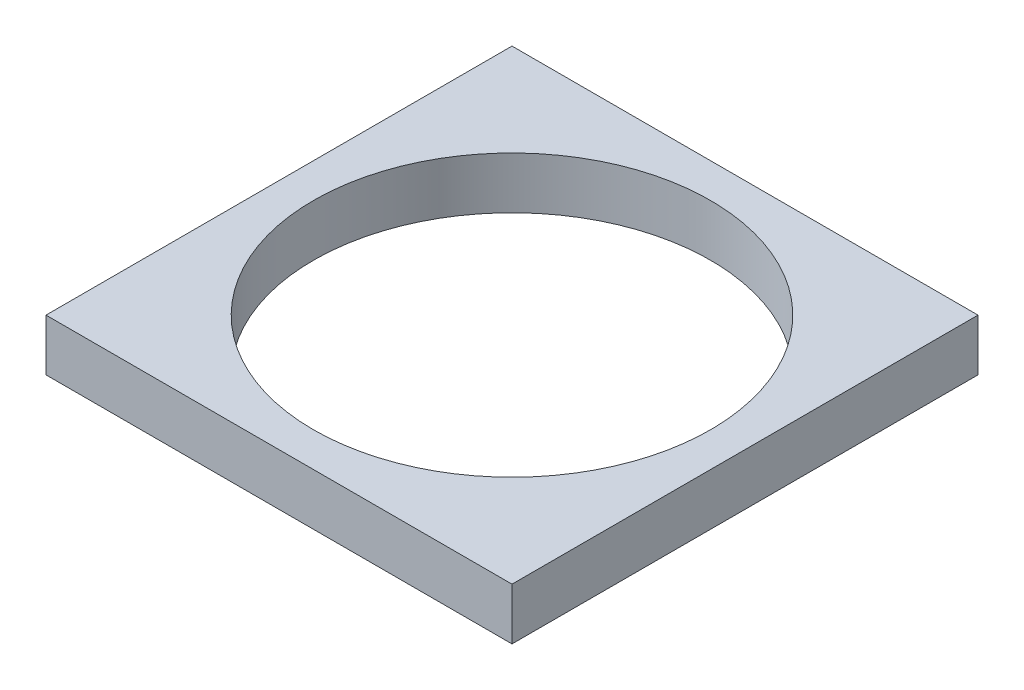
ISO-10303-21;
HEADER;
FILE_DESCRIPTION(('STEP AP214'),'2;1');
FILE_NAME('part.step','',(''),(''),'','','');
FILE_SCHEMA(('AUTOMOTIVE_DESIGN { 1 0 10303 214 1 1 1 1 }'));
ENDSEC;
DATA;
#1=APPLICATION_CONTEXT('core data for automotive mechanical design processes');
#2=APPLICATION_PROTOCOL_DEFINITION('international standard','automotive_design',2000,#1);
#3=PRODUCT_CONTEXT('',#1,'mechanical');
#4=PRODUCT('Part','Part','',(#3));
#5=PRODUCT_RELATED_PRODUCT_CATEGORY('part','',(#4));
#6=PRODUCT_DEFINITION_FORMATION('','',#4);
#7=PRODUCT_DEFINITION_CONTEXT('part definition',#1,'design');
#8=PRODUCT_DEFINITION('design','',#6,#7);
#9=PRODUCT_DEFINITION_SHAPE('','',#8);
#10=(LENGTH_UNIT() NAMED_UNIT(*) SI_UNIT(.MILLI.,.METRE.));
#11=(NAMED_UNIT(*) PLANE_ANGLE_UNIT() SI_UNIT($,.RADIAN.));
#12=(NAMED_UNIT(*) SI_UNIT($,.STERADIAN.) SOLID_ANGLE_UNIT());
#13=UNCERTAINTY_MEASURE_WITH_UNIT(LENGTH_MEASURE(1.E-05),#10,'distance_accuracy_value','');
#14=(GEOMETRIC_REPRESENTATION_CONTEXT(3) GLOBAL_UNCERTAINTY_ASSIGNED_CONTEXT((#13)) GLOBAL_UNIT_ASSIGNED_CONTEXT((#10,
#11,#12)) REPRESENTATION_CONTEXT('',''));
#15=CARTESIAN_POINT('',(0.,0.,0.));
#16=DIRECTION('',(0.,0.,1.));
#17=DIRECTION('',(1.,0.,0.));
#18=AXIS2_PLACEMENT_3D('',#15,#16,#17);
#19=CARTESIAN_POINT('',(22.5,5.,22.5));
#20=DIRECTION('',(-1.,0.,0.));
#21=DIRECTION('',(0.,0.,1.));
#22=AXIS2_PLACEMENT_3D('',#19,#20,#21);
#23=PLANE('',#22);
#24=DIRECTION('',(0.,0.,-1.));
#25=VECTOR('',#24,1.);
#26=CARTESIAN_POINT('',(22.5,0.,22.5));
#27=LINE('',#26,#25);
#28=CARTESIAN_POINT('',(22.5,0.,22.5));
#29=VERTEX_POINT('',#28);
#30=CARTESIAN_POINT('',(22.5,0.,-22.5));
#31=VERTEX_POINT('',#30);
#32=EDGE_CURVE('E111',#29,#31,#27,.T.);
#33=ORIENTED_EDGE('',*,*,#32,.T.);
#34=DIRECTION('',(0.,-1.,0.));
#35=VECTOR('',#34,1.);
#36=CARTESIAN_POINT('',(22.5,5.,-22.5));
#37=LINE('',#36,#35);
#38=CARTESIAN_POINT('',(22.5,5.,-22.5));
#39=VERTEX_POINT('',#38);
#40=EDGE_CURVE('E11',#39,#31,#37,.T.);
#41=ORIENTED_EDGE('',*,*,#40,.F.);
#42=DIRECTION('',(0.,0.,-1.));
#43=VECTOR('',#42,1.);
#44=CARTESIAN_POINT('',(22.5,5.,22.5));
#45=LINE('',#44,#43);
#46=CARTESIAN_POINT('',(22.5,5.,22.5));
#47=VERTEX_POINT('',#46);
#48=EDGE_CURVE('E95',#47,#39,#45,.T.);
#49=ORIENTED_EDGE('',*,*,#48,.F.);
#50=DIRECTION('',(0.,-1.,0.));
#51=VECTOR('',#50,1.);
#52=CARTESIAN_POINT('',(22.5,5.,22.5));
#53=LINE('',#52,#51);
#54=EDGE_CURVE('E107',#47,#29,#53,.T.);
#55=ORIENTED_EDGE('',*,*,#54,.T.);
#56=EDGE_LOOP('',(#33,#41,#49,#55));
#57=FACE_BOUND('',#56,.T.);
#58=ADVANCED_FACE('F43',(#57),#23,.F.);
#59=CARTESIAN_POINT('',(-22.5,5.,-22.5));
#60=DIRECTION('',(0.,0.,1.));
#61=DIRECTION('',(1.,0.,0.));
#62=AXIS2_PLACEMENT_3D('',#59,#60,#61);
#63=PLANE('',#62);
#64=DIRECTION('',(-1.,0.,0.));
#65=VECTOR('',#64,1.);
#66=CARTESIAN_POINT('',(-22.5,0.,-22.5));
#67=LINE('',#66,#65);
#68=CARTESIAN_POINT('',(-22.5,0.,-22.5));
#69=VERTEX_POINT('',#68);
#70=EDGE_CURVE('E100',#31,#69,#67,.T.);
#71=ORIENTED_EDGE('',*,*,#70,.T.);
#72=DIRECTION('',(0.,-1.,0.));
#73=VECTOR('',#72,1.);
#74=CARTESIAN_POINT('',(-22.5,5.,-22.5));
#75=LINE('',#74,#73);
#76=CARTESIAN_POINT('',(-22.5,5.,-22.5));
#77=VERTEX_POINT('',#76);
#78=EDGE_CURVE('E52',#77,#69,#75,.T.);
#79=ORIENTED_EDGE('',*,*,#78,.F.);
#80=DIRECTION('',(-1.,0.,0.));
#81=VECTOR('',#80,1.);
#82=CARTESIAN_POINT('',(-22.5,5.,-22.5));
#83=LINE('',#82,#81);
#84=EDGE_CURVE('E90',#39,#77,#83,.T.);
#85=ORIENTED_EDGE('',*,*,#84,.F.);
#86=ORIENTED_EDGE('',*,*,#40,.T.);
#87=EDGE_LOOP('',(#71,#79,#85,#86));
#88=FACE_BOUND('',#87,.T.);
#89=ADVANCED_FACE('F99',(#88),#63,.F.);
#90=CARTESIAN_POINT('',(-22.5,5.,22.5));
#91=DIRECTION('',(1.,0.,0.));
#92=DIRECTION('',(0.,0.,-1.));
#93=AXIS2_PLACEMENT_3D('',#90,#91,#92);
#94=PLANE('',#93);
#95=DIRECTION('',(0.,0.,1.));
#96=VECTOR('',#95,1.);
#97=CARTESIAN_POINT('',(-22.5,0.,22.5));
#98=LINE('',#97,#96);
#99=CARTESIAN_POINT('',(-22.5,0.,22.5));
#100=VERTEX_POINT('',#99);
#101=EDGE_CURVE('E77',#69,#100,#98,.T.);
#102=ORIENTED_EDGE('',*,*,#101,.T.);
#103=DIRECTION('',(0.,-1.,0.));
#104=VECTOR('',#103,1.);
#105=CARTESIAN_POINT('',(-22.5,5.,22.5));
#106=LINE('',#105,#104);
#107=CARTESIAN_POINT('',(-22.5,5.,22.5));
#108=VERTEX_POINT('',#107);
#109=EDGE_CURVE('E102',#108,#100,#106,.T.);
#110=ORIENTED_EDGE('',*,*,#109,.F.);
#111=DIRECTION('',(0.,0.,1.));
#112=VECTOR('',#111,1.);
#113=CARTESIAN_POINT('',(-22.5,5.,22.5));
#114=LINE('',#113,#112);
#115=EDGE_CURVE('E93',#77,#108,#114,.T.);
#116=ORIENTED_EDGE('',*,*,#115,.F.);
#117=ORIENTED_EDGE('',*,*,#78,.T.);
#118=EDGE_LOOP('',(#102,#110,#116,#117));
#119=FACE_BOUND('',#118,.T.);
#120=ADVANCED_FACE('F103',(#119),#94,.F.);
#121=CARTESIAN_POINT('',(-22.5,5.,22.5));
#122=DIRECTION('',(0.,0.,-1.));
#123=DIRECTION('',(-1.,0.,0.));
#124=AXIS2_PLACEMENT_3D('',#121,#122,#123);
#125=PLANE('',#124);
#126=DIRECTION('',(1.,0.,0.));
#127=VECTOR('',#126,1.);
#128=CARTESIAN_POINT('',(-22.5,0.,22.5));
#129=LINE('',#128,#127);
#130=EDGE_CURVE('E83',#100,#29,#129,.T.);
#131=ORIENTED_EDGE('',*,*,#130,.T.);
#132=ORIENTED_EDGE('',*,*,#54,.F.);
#133=DIRECTION('',(1.,0.,0.));
#134=VECTOR('',#133,1.);
#135=CARTESIAN_POINT('',(-22.5,5.,22.5));
#136=LINE('',#135,#134);
#137=EDGE_CURVE('E60',#108,#47,#136,.T.);
#138=ORIENTED_EDGE('',*,*,#137,.F.);
#139=ORIENTED_EDGE('',*,*,#109,.T.);
#140=EDGE_LOOP('',(#131,#132,#138,#139));
#141=FACE_BOUND('',#140,.T.);
#142=ADVANCED_FACE('F125',(#141),#125,.F.);
#143=CARTESIAN_POINT('',(0.,5.,0.));
#144=DIRECTION('',(0.,-1.,0.));
#145=DIRECTION('',(0.,0.,-1.));
#146=AXIS2_PLACEMENT_3D('',#143,#144,#145);
#147=PLANE('',#146);
#148=CARTESIAN_POINT('',(0.,5.,0.));
#149=DIRECTION('',(0.,1.,0.));
#150=DIRECTION('',(0.,0.,1.));
#151=AXIS2_PLACEMENT_3D('',#148,#149,#150);
#152=CIRCLE('',#151,19.175);
#153=CARTESIAN_POINT('',(0.,5.,19.175));
#154=VERTEX_POINT('',#153);
#155=EDGE_CURVE('E132',#154,#154,#152,.T.);
#156=ORIENTED_EDGE('',*,*,#155,.F.);
#157=EDGE_LOOP('',(#156));
#158=FACE_BOUND('',#157,.T.);
#159=ORIENTED_EDGE('',*,*,#48,.T.);
#160=ORIENTED_EDGE('',*,*,#84,.T.);
#161=ORIENTED_EDGE('',*,*,#115,.T.);
#162=ORIENTED_EDGE('',*,*,#137,.T.);
#163=EDGE_LOOP('',(#159,#160,#161,#162));
#164=FACE_BOUND('',#163,.T.);
#165=ADVANCED_FACE('F91',(#158,#164),#147,.F.);
#166=CARTESIAN_POINT('',(0.,0.,0.));
#167=DIRECTION('',(0.,-1.,0.));
#168=DIRECTION('',(0.,0.,-1.));
#169=AXIS2_PLACEMENT_3D('',#166,#167,#168);
#170=PLANE('',#169);
#171=CARTESIAN_POINT('',(0.,0.,0.));
#172=DIRECTION('',(0.,1.,0.));
#173=DIRECTION('',(0.,0.,1.));
#174=AXIS2_PLACEMENT_3D('',#171,#172,#173);
#175=CIRCLE('',#174,19.175);
#176=CARTESIAN_POINT('',(0.,0.,19.175));
#177=VERTEX_POINT('',#176);
#178=EDGE_CURVE('E115',#177,#177,#175,.T.);
#179=ORIENTED_EDGE('',*,*,#178,.T.);
#180=EDGE_LOOP('',(#179));
#181=FACE_BOUND('',#180,.T.);
#182=ORIENTED_EDGE('',*,*,#32,.F.);
#183=ORIENTED_EDGE('',*,*,#130,.F.);
#184=ORIENTED_EDGE('',*,*,#101,.F.);
#185=ORIENTED_EDGE('',*,*,#70,.F.);
#186=EDGE_LOOP('',(#182,#183,#184,#185));
#187=FACE_BOUND('',#186,.T.);
#188=ADVANCED_FACE('F128',(#181,#187),#170,.T.);
#189=CARTESIAN_POINT('',(0.,0.,0.));
#190=DIRECTION('',(0.,1.,0.));
#191=DIRECTION('',(0.,0.,1.));
#192=AXIS2_PLACEMENT_3D('',#189,#190,#191);
#193=CYLINDRICAL_SURFACE('',#192,19.175);
#194=ORIENTED_EDGE('',*,*,#178,.F.);
#195=EDGE_LOOP('',(#194));
#196=FACE_BOUND('',#195,.T.);
#197=ORIENTED_EDGE('',*,*,#155,.T.);
#198=EDGE_LOOP('',(#197));
#199=FACE_BOUND('',#198,.T.);
#200=ADVANCED_FACE('F141',(#196,#199),#193,.F.);
#201=CLOSED_SHELL('',(#58,#89,#120,#142,#165,#188,#200));
#202=MANIFOLD_SOLID_BREP('B2',#201);
#203=ADVANCED_BREP_SHAPE_REPRESENTATION('',(#18,#202),#14);
#204=SHAPE_DEFINITION_REPRESENTATION(#9,#203);
ENDSEC;
END-ISO-10303-21;
